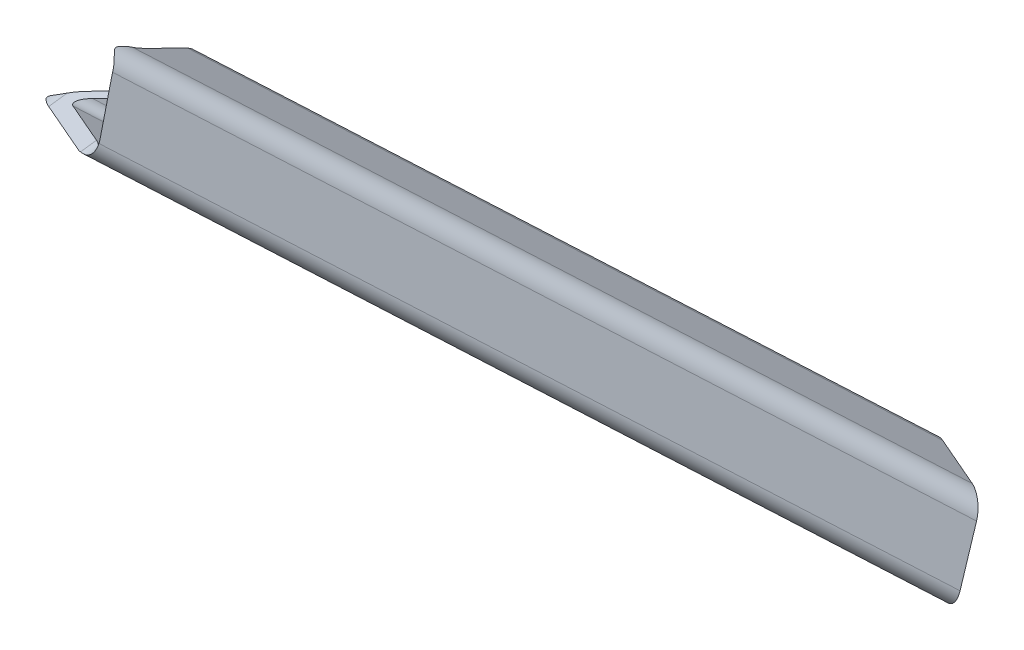
ISO-10303-21;
HEADER;
FILE_DESCRIPTION(('STEP AP214'),'2;1');
FILE_NAME('part.step','',(''),(''),'','','');
FILE_SCHEMA(('AUTOMOTIVE_DESIGN { 1 0 10303 214 1 1 1 1 }'));
ENDSEC;
DATA;
#1=APPLICATION_CONTEXT('core data for automotive mechanical design processes');
#2=APPLICATION_PROTOCOL_DEFINITION('international standard','automotive_design',2000,#1);
#3=PRODUCT_CONTEXT('',#1,'mechanical');
#4=PRODUCT('Part','Part','',(#3));
#5=PRODUCT_RELATED_PRODUCT_CATEGORY('part','',(#4));
#6=PRODUCT_DEFINITION_FORMATION('','',#4);
#7=PRODUCT_DEFINITION_CONTEXT('part definition',#1,'design');
#8=PRODUCT_DEFINITION('design','',#6,#7);
#9=PRODUCT_DEFINITION_SHAPE('','',#8);
#10=(LENGTH_UNIT() NAMED_UNIT(*) SI_UNIT(.MILLI.,.METRE.));
#11=(NAMED_UNIT(*) PLANE_ANGLE_UNIT() SI_UNIT($,.RADIAN.));
#12=(NAMED_UNIT(*) SI_UNIT($,.STERADIAN.) SOLID_ANGLE_UNIT());
#13=UNCERTAINTY_MEASURE_WITH_UNIT(LENGTH_MEASURE(1.E-05),#10,'distance_accuracy_value','');
#14=(GEOMETRIC_REPRESENTATION_CONTEXT(3) GLOBAL_UNCERTAINTY_ASSIGNED_CONTEXT((#13)) GLOBAL_UNIT_ASSIGNED_CONTEXT((#10,
#11,#12)) REPRESENTATION_CONTEXT('',''));
#15=CARTESIAN_POINT('',(0.,0.,0.));
#16=DIRECTION('',(0.,0.,1.));
#17=DIRECTION('',(1.,0.,0.));
#18=AXIS2_PLACEMENT_3D('',#15,#16,#17);
#19=CARTESIAN_POINT('',(-176.376219057879,-6.76934376969705,-997.430262814315));
#20=DIRECTION('',(0.708778209555371,0.212903658810695,0.672536602516548));
#21=DIRECTION('',(0.688317522845566,0.,-0.725409531053835));
#22=AXIS2_PLACEMENT_3D('',#19,#20,#21);
#23=PLANE('',#22);
#24=DIRECTION('',(0.672536602516548,-0.491671667636119,-0.553130626090634));
#25=VECTOR('',#24,1.);
#26=CARTESIAN_POINT('',(-176.376219057879,-6.76934376969705,-997.430262814315));
#27=LINE('',#26,#25);
#28=CARTESIAN_POINT('',(-171.957142857143,-10.,-1001.06475107341));
#29=VERTEX_POINT('',#28);
#30=CARTESIAN_POINT('',(-68.,-85.9999999999999,-1086.56475107341));
#31=VERTEX_POINT('',#30);
#32=EDGE_CURVE('E271',#29,#31,#27,.T.);
#33=ORIENTED_EDGE('',*,*,#32,.T.);
#34=DIRECTION('',(0.,0.953369256848501,-0.301806328787413));
#35=VECTOR('',#34,1.);
#36=CARTESIAN_POINT('',(-68.0000000000001,-39.6331539182495,-1101.24301712075));
#37=LINE('',#36,#35);
#38=CARTESIAN_POINT('',(-68.0000000000001,-73.9999999999998,-1090.36356870827));
#39=VERTEX_POINT('',#38);
#40=EDGE_CURVE('E273',#31,#39,#37,.T.);
#41=ORIENTED_EDGE('',*,*,#40,.T.);
#42=DIRECTION('',(0.672536602516548,-0.491671667636119,-0.553130626090634));
#43=VECTOR('',#42,1.);
#44=CARTESIAN_POINT('',(-173.82137515215,3.36288522872609,-1003.33032282595));
#45=LINE('',#44,#43);
#46=CARTESIAN_POINT('',(-161.475922176263,-5.66251120273223,-1013.48389381134));
#47=VERTEX_POINT('',#46);
#48=EDGE_CURVE('E45',#47,#39,#45,.T.);
#49=ORIENTED_EDGE('',*,*,#48,.F.);
#50=DIRECTION('',(0.0310586126136645,-0.961862937380512,0.271762860369564));
#51=VECTOR('',#50,1.);
#52=CARTESIAN_POINT('',(-161.321727986959,-10.4377945579732,-1012.13469465493));
#53=LINE('',#52,#51);
#54=CARTESIAN_POINT('',(-161.46502464252,-6.00000000000001,-1013.38854039109));
#55=VERTEX_POINT('',#54);
#56=EDGE_CURVE('E278',#47,#55,#53,.T.);
#57=ORIENTED_EDGE('',*,*,#56,.T.);
#58=CARTESIAN_POINT('',(-165.058275621129,-6.00000000000001,-1009.6016565463));
#59=DIRECTION('',(0.708778209555371,0.212903658810695,0.672536602516548));
#60=DIRECTION('',(-0.629148245586715,-0.240432271061151,0.739164939717473));
#61=AXIS2_PLACEMENT_3D('',#58,#59,#60);
#62=ELLIPSE('',#61,5.34283333451752,4.);
#63=CARTESIAN_POINT('',(-164.929115378409,-10.,-1008.47150442251));
#64=VERTEX_POINT('',#63);
#65=EDGE_CURVE('E283',#55,#64,#62,.F.);
#66=ORIENTED_EDGE('',*,*,#65,.T.);
#67=DIRECTION('',(-0.688317522845566,0.,0.725409531053835));
#68=VECTOR('',#67,1.);
#69=CARTESIAN_POINT('',(-175.865561186811,-10.,-996.945716160614));
#70=LINE('',#69,#68);
#71=EDGE_CURVE('E270',#64,#29,#70,.T.);
#72=ORIENTED_EDGE('',*,*,#71,.T.);
#73=EDGE_LOOP('',(#33,#41,#49,#57,#66,#72));
#74=FACE_BOUND('',#73,.T.);
#75=ADVANCED_FACE('F41',(#74),#23,.T.);
#76=CARTESIAN_POINT('',(-174.958662638768,-6.34353645207573,-996.085189609282));
#77=DIRECTION('',(0.672536602516548,-0.491671667636119,-0.553130626090634));
#78=DIRECTION('',(-0.635212340611803,0.,-0.77233754429943));
#79=AXIS2_PLACEMENT_3D('',#76,#77,#78);
#80=CYLINDRICAL_SURFACE('',#79,2.);
#81=DIRECTION('',(0.672536602516548,-0.491671667636119,-0.553130626090634));
#82=VECTOR('',#81,1.);
#83=CARTESIAN_POINT('',(-175.384469956389,-8.03224128514622,-995.10184627401));
#84=LINE('',#83,#82);
#85=CARTESIAN_POINT('',(-172.692857142857,-10.,-997.31557482822));
#86=VERTEX_POINT('',#85);
#87=CARTESIAN_POINT('',(-66.,-87.9999999999999,-1085.06557482822));
#88=VERTEX_POINT('',#87);
#89=EDGE_CURVE('E267',#86,#88,#84,.T.);
#90=ORIENTED_EDGE('',*,*,#89,.T.);
#91=CARTESIAN_POINT('',(-66.0000000000001,-85.9999999999999,-1085.6987111007));
#92=DIRECTION('',(0.38158995692014,-0.278969159106107,-0.881229432693505));
#93=DIRECTION('',(0.7113947110933,-0.520079684350193,0.472688784460434));
#94=AXIS2_PLACEMENT_3D('',#91,#92,#93);
#95=ELLIPSE('',#94,2.26955651479654,2.);
#96=EDGE_CURVE('E269',#88,#31,#95,.T.);
#97=ORIENTED_EDGE('',*,*,#96,.T.);
#98=ORIENTED_EDGE('',*,*,#32,.F.);
#99=CARTESIAN_POINT('',(-169.957142857143,-10.,-1000.1987111007));
#100=DIRECTION('',(0.,1.,0.));
#101=DIRECTION('',(0.77233754429943,0.,-0.635212340611803));
#102=AXIS2_PLACEMENT_3D('',#99,#100,#101);
#103=ELLIPSE('',#102,4.06775523514644,2.);
#104=EDGE_CURVE('E266',#29,#86,#103,.T.);
#105=ORIENTED_EDGE('',*,*,#104,.T.);
#106=EDGE_LOOP('',(#90,#97,#98,#105));
#107=FACE_BOUND('',#106,.T.);
#108=ADVANCED_FACE('F368',(#107),#80,.F.);
#109=CARTESIAN_POINT('',(-175.384469956389,-8.03224128514622,-995.10184627401));
#110=DIRECTION('',(0.212903658810694,0.844352416535263,-0.491671667636119));
#111=DIRECTION('',(0.,0.503208632889708,0.864164956351084));
#112=AXIS2_PLACEMENT_3D('',#109,#110,#111);
#113=PLANE('',#112);
#114=DIRECTION('',(0.672536602516548,-0.491671667636119,-0.553130626090634));
#115=VECTOR('',#114,1.);
#116=CARTESIAN_POINT('',(-166.879131441725,-5.47739737941787,-987.031407043811));
#117=LINE('',#116,#115);
#118=CARTESIAN_POINT('',(-161.245350120166,-9.59608868499616,-991.664934762587));
#119=VERTEX_POINT('',#118);
#120=CARTESIAN_POINT('',(-54.0000000000001,-87.9999999999999,-1079.86933499197));
#121=VERTEX_POINT('',#120);
#122=EDGE_CURVE('E262',#119,#121,#117,.T.);
#123=ORIENTED_EDGE('',*,*,#122,.T.);
#124=DIRECTION('',(-0.917660497954147,0.,-0.397365336302184));
#125=VECTOR('',#124,1.);
#126=CARTESIAN_POINT('',(-125.307792250396,-87.9999999999999,-1110.7470342192));
#127=LINE('',#126,#125);
#128=EDGE_CURVE('E265',#121,#88,#127,.T.);
#129=ORIENTED_EDGE('',*,*,#128,.T.);
#130=ORIENTED_EDGE('',*,*,#89,.F.);
#131=DIRECTION('',(0.917660497954147,0.,0.397365336302183));
#132=VECTOR('',#131,1.);
#133=CARTESIAN_POINT('',(-174.152238110074,-10.,-997.94751595473));
#134=LINE('',#133,#132);
#135=CARTESIAN_POINT('',(-163.183555701295,-10.,-993.197857247754));
#136=VERTEX_POINT('',#135);
#137=EDGE_CURVE('E290',#86,#136,#134,.T.);
#138=ORIENTED_EDGE('',*,*,#137,.T.);
#139=CARTESIAN_POINT('',(-162.357626347843,-6.00000000000001,-985.970975405053));
#140=DIRECTION('',(0.212903658810694,0.844352416535263,-0.491671667636119));
#141=DIRECTION('',(0.239820394157188,0.442656968875484,0.864026033434329));
#142=AXIS2_PLACEMENT_3D('',#139,#140,#141);
#143=ELLIPSE('',#142,8.6147970353693,4.);
#144=EDGE_CURVE('E261',#136,#119,#143,.F.);
#145=ORIENTED_EDGE('',*,*,#144,.T.);
#146=EDGE_LOOP('',(#123,#129,#130,#138,#145));
#147=FACE_BOUND('',#146,.T.);
#148=ADVANCED_FACE('F363',(#147),#113,.T.);
#149=CARTESIAN_POINT('',(-166.453324124103,-3.78869254634738,-988.014750379083));
#150=DIRECTION('',(0.672536602516548,-0.491671667636119,-0.553130626090634));
#151=DIRECTION('',(-0.635212340611803,0.,-0.77233754429943));
#152=AXIS2_PLACEMENT_3D('',#149,#150,#151);
#153=CYLINDRICAL_SURFACE('',#152,2.);
#154=DIRECTION('',(0.672536602516548,-0.491671667636119,-0.553130626090634));
#155=VECTOR('',#154,1.);
#156=CARTESIAN_POINT('',(-165.035767704993,-3.36288522872595,-986.66967717405));
#157=LINE('',#156,#155);
#158=CARTESIAN_POINT('',(-159.277059979029,-7.57290654274652,-991.405951152323));
#159=VERTEX_POINT('',#158);
#160=CARTESIAN_POINT('',(-51.9999999999999,-85.9999999999999,-1079.63643129173));
#161=VERTEX_POINT('',#160);
#162=EDGE_CURVE('E257',#159,#161,#157,.T.);
#163=ORIENTED_EDGE('',*,*,#162,.T.);
#164=CARTESIAN_POINT('',(-54.,-85.9999999999999,-1080.50247126444));
#165=DIRECTION('',(0.38158995692014,-0.278969159106107,-0.881229432693505));
#166=DIRECTION('',(0.7113947110933,-0.520079684350193,0.472688784460434));
#167=AXIS2_PLACEMENT_3D('',#164,#165,#166);
#168=ELLIPSE('',#167,2.26955651479654,2.);
#169=EDGE_CURVE('E260',#161,#121,#168,.T.);
#170=ORIENTED_EDGE('',*,*,#169,.T.);
#171=ORIENTED_EDGE('',*,*,#122,.F.);
#172=CARTESIAN_POINT('',(-161.245350120166,-9.59608868499616,-991.664934762587));
#173=CARTESIAN_POINT('',(-161.211785649101,-9.58199244129275,-991.626172332089));
#174=CARTESIAN_POINT('',(-161.176842190155,-9.56669939756344,-991.589060681059));
#175=CARTESIAN_POINT('',(-161.104739244785,-9.53368399526599,-991.518274307102));
#176=CARTESIAN_POINT('',(-161.067581152035,-9.51596315558062,-991.484597458086));
#177=CARTESIAN_POINT('',(-160.991679716209,-9.4781048068601,-991.420878250348));
#178=CARTESIAN_POINT('',(-160.952942321977,-9.45797589788048,-991.390823684321));
#179=CARTESIAN_POINT('',(-160.874271817586,-9.41524926024835,-991.334257802205));
#180=CARTESIAN_POINT('',(-160.834338546033,-9.39265119726272,-991.307746967033));
#181=CARTESIAN_POINT('',(-160.713623878925,-9.32124897613953,-991.233656447006));
#182=CARTESIAN_POINT('',(-160.631715294953,-9.26873353791489,-991.191344676823));
#183=CARTESIAN_POINT('',(-160.468448517828,-9.15424599812852,-991.120780282041));
#184=CARTESIAN_POINT('',(-160.387090826144,-9.09226624488471,-991.09253911267));
#185=CARTESIAN_POINT('',(-160.223834720701,-8.9563210350527,-991.048870404367));
#186=CARTESIAN_POINT('',(-160.142114321532,-8.88190998625724,-991.034157553852));
#187=CARTESIAN_POINT('',(-159.985352013993,-8.72505342414195,-991.019882477441));
#188=CARTESIAN_POINT('',(-159.910309896425,-8.64260816266377,-991.020319776799));
#189=CARTESIAN_POINT('',(-159.767707497347,-8.47000234341472,-991.036326612519));
#190=CARTESIAN_POINT('',(-159.700329692781,-8.37971927636671,-991.052202681487));
#191=CARTESIAN_POINT('',(-159.576571187995,-8.19568831057253,-991.099317663142));
#192=CARTESIAN_POINT('',(-159.520188524438,-8.1019410339725,-991.130553829553));
#193=CARTESIAN_POINT('',(-159.430265330982,-7.93451077745085,-991.19967121199));
#194=CARTESIAN_POINT('',(-159.394420541497,-7.86085471949146,-991.234672641881));
#195=CARTESIAN_POINT('',(-159.330169855464,-7.71521773630569,-991.313644258173));
#196=CARTESIAN_POINT('',(-159.301757716872,-7.6432354520153,-991.357606863284));
#197=CARTESIAN_POINT('',(-159.277059979028,-7.57290654274661,-991.405951152323));
#198=B_SPLINE_CURVE_WITH_KNOTS('',3,(#172,#173,#174,#175,#176,#177,#178,#179,#180,#181,#182,
#183,#184,#185,#186,#187,#188,#189,#190,#191,#192,#193,#194,#195,#196,#197),.UNSPECIFIED.,.F.,
.F.,(4,2,2,2,2,2,2,2,2,2,2,2,4),(0.,0.159451814959154,0.318804325044844,0.477603829337676,
0.636424862413436,0.953197765635142,1.27022814187687,1.60317901989294,1.93611946453498,
2.27580821190034,2.61543624740165,2.88192237694791,3.14818398398992),.UNSPECIFIED.);
#199=EDGE_CURVE('E256',#119,#159,#198,.T.);
#200=ORIENTED_EDGE('',*,*,#199,.T.);
#201=EDGE_LOOP('',(#163,#170,#171,#200));
#202=FACE_BOUND('',#201,.T.);
#203=ADVANCED_FACE('F357',(#202),#153,.F.);
#204=CARTESIAN_POINT('',(-162.480923799264,6.76934376969719,-992.569737185684));
#205=DIRECTION('',(-0.708778209555371,-0.212903658810695,-0.672536602516548));
#206=DIRECTION('',(-0.688317522845566,0.,0.725409531053835));
#207=AXIS2_PLACEMENT_3D('',#204,#205,#206);
#208=PLANE('',#207);
#209=DIRECTION('',(0.672536602516548,-0.491671667636119,-0.553130626090634));
#210=VECTOR('',#209,1.);
#211=CARTESIAN_POINT('',(-162.480923799264,6.76934376969719,-992.569737185684));
#212=LINE('',#211,#210);
#213=CARTESIAN_POINT('',(-159.377443764703,4.5004810812451,-995.122207710192));
#214=VERTEX_POINT('',#213);
#215=CARTESIAN_POINT('',(-51.9999999999999,-73.9999999999999,-1083.43524892659));
#216=VERTEX_POINT('',#215);
#217=EDGE_CURVE('E252',#214,#216,#212,.T.);
#218=ORIENTED_EDGE('',*,*,#217,.T.);
#219=DIRECTION('',(0.,-0.953369256848501,0.301806328787413));
#220=VECTOR('',#219,1.);
#221=CARTESIAN_POINT('',(-51.9999999999999,-26.7326932670135,-1098.39857212406));
#222=LINE('',#221,#220);
#223=EDGE_CURVE('E255',#216,#161,#222,.T.);
#224=ORIENTED_EDGE('',*,*,#223,.T.);
#225=ORIENTED_EDGE('',*,*,#162,.F.);
#226=CARTESIAN_POINT('',(-162.631633572031,-6.00000000000001,-988.368538616696));
#227=DIRECTION('',(-0.708778209555371,-0.212903658810695,-0.672536602516548));
#228=DIRECTION('',(-0.629148245586715,-0.240432271061151,0.739164939717473));
#229=AXIS2_PLACEMENT_3D('',#226,#227,#228);
#230=ELLIPSE('',#229,5.34283333451752,4.);
#231=CARTESIAN_POINT('',(-159.038382593422,-6.00000000000001,-992.155422461488));
#232=VERTEX_POINT('',#231);
#233=EDGE_CURVE('E294',#159,#232,#230,.F.);
#234=ORIENTED_EDGE('',*,*,#233,.T.);
#235=DIRECTION('',(-0.0310586126136645,0.961862937380512,-0.271762860369564));
#236=VECTOR('',#235,1.);
#237=CARTESIAN_POINT('',(-159.426673467823,6.02508964757599,-995.55296761249));
#238=LINE('',#237,#236);
#239=EDGE_CURVE('E251',#232,#214,#238,.T.);
#240=ORIENTED_EDGE('',*,*,#239,.T.);
#241=EDGE_LOOP('',(#218,#224,#225,#234,#240));
#242=FACE_BOUND('',#241,.T.);
#243=ADVANCED_FACE('F362',(#242),#208,.T.);
#244=CARTESIAN_POINT('',(-163.898480218375,6.34353645207576,-993.914810390717));
#245=DIRECTION('',(0.672536602516548,-0.491671667636119,-0.553130626090634));
#246=DIRECTION('',(-0.635212340611803,0.,-0.77233754429943));
#247=AXIS2_PLACEMENT_3D('',#244,#245,#246);
#248=CYLINDRICAL_SURFACE('',#247,2.);
#249=DIRECTION('',(0.672536602516548,-0.491671667636119,-0.553130626090634));
#250=VECTOR('',#249,1.);
#251=CARTESIAN_POINT('',(-163.472672900754,8.03224128514636,-994.898153725989));
#252=LINE('',#251,#250);
#253=CARTESIAN_POINT('',(-159.705895043777,5.27846112861006,-997.996156402092));
#254=VERTEX_POINT('',#253);
#255=CARTESIAN_POINT('',(-54.,-71.9999999999999,-1084.93442517178));
#256=VERTEX_POINT('',#255);
#257=EDGE_CURVE('E247',#254,#256,#252,.T.);
#258=ORIENTED_EDGE('',*,*,#257,.T.);
#259=CARTESIAN_POINT('',(-54.,-73.9999999999999,-1084.3012888993));
#260=DIRECTION('',(0.38158995692014,-0.278969159106107,-0.881229432693505));
#261=DIRECTION('',(0.7113947110933,-0.520079684350193,0.472688784460434));
#262=AXIS2_PLACEMENT_3D('',#259,#260,#261);
#263=ELLIPSE('',#262,2.26955651479654,2.);
#264=EDGE_CURVE('E250',#256,#216,#263,.T.);
#265=ORIENTED_EDGE('',*,*,#264,.T.);
#266=ORIENTED_EDGE('',*,*,#217,.F.);
#267=CARTESIAN_POINT('',(-159.639753566148,3.23010704574787,-997.417418472836));
#268=DIRECTION('',(-0.993532672656404,0.,0.113546591160732));
#269=DIRECTION('',(-0.0787371194250936,-0.720519705515419,-0.68894979496957));
#270=AXIS2_PLACEMENT_3D('',#267,#268,#269);
#271=ELLIPSE('',#270,2.73600361870277,2.);
#272=EDGE_CURVE('E246',#214,#254,#271,.T.);
#273=ORIENTED_EDGE('',*,*,#272,.T.);
#274=EDGE_LOOP('',(#258,#265,#266,#273));
#275=FACE_BOUND('',#274,.T.);
#276=ADVANCED_FACE('F483',(#275),#248,.F.);
#277=CARTESIAN_POINT('',(-163.472672900754,8.03224128514636,-994.898153725989));
#278=DIRECTION('',(-0.212903658810694,-0.844352416535263,0.491671667636119));
#279=DIRECTION('',(0.,-0.503208632889708,-0.864164956351084));
#280=AXIS2_PLACEMENT_3D('',#277,#278,#279);
#281=PLANE('',#280);
#282=DIRECTION('',(0.672536602516548,-0.491671667636119,-0.553130626090634));
#283=VECTOR('',#282,1.);
#284=CARTESIAN_POINT('',(-171.978011415418,5.47739737941801,-1002.96859295619));
#285=LINE('',#284,#283);
#286=CARTESIAN_POINT('',(-161.279753852447,-2.34378308437295,-1011.76742097795));
#287=VERTEX_POINT('',#286);
#288=CARTESIAN_POINT('',(-66.0000000000001,-71.9999999999999,-1090.13066500803));
#289=VERTEX_POINT('',#288);
#290=EDGE_CURVE('E243',#287,#289,#285,.T.);
#291=ORIENTED_EDGE('',*,*,#290,.T.);
#292=DIRECTION('',(0.917660497954147,0.,0.397365336302184));
#293=VECTOR('',#292,1.);
#294=CARTESIAN_POINT('',(-113.355615509971,-71.9999999999999,-1110.63659298997));
#295=LINE('',#294,#293);
#296=EDGE_CURVE('E223',#289,#256,#295,.T.);
#297=ORIENTED_EDGE('',*,*,#296,.T.);
#298=ORIENTED_EDGE('',*,*,#257,.F.);
#299=DIRECTION('',(-0.099495133200515,-0.481857838250816,-0.870582415504507));
#300=VECTOR('',#299,1.);
#301=CARTESIAN_POINT('',(-159.342815300212,7.03686693921575,-994.819208645901));
#302=LINE('',#301,#300);
#303=EDGE_CURVE('E304',#254,#287,#302,.T.);
#304=ORIENTED_EDGE('',*,*,#303,.T.);
#305=EDGE_LOOP('',(#291,#297,#298,#304));
#306=FACE_BOUND('',#305,.T.);
#307=ADVANCED_FACE('F481',(#306),#281,.T.);
#308=CARTESIAN_POINT('',(-172.403818733039,3.78869254634741,-1001.98524962092));
#309=DIRECTION('',(0.672536602516548,-0.491671667636119,-0.553130626090634));
#310=DIRECTION('',(-0.635212340611803,0.,-0.77233754429943));
#311=AXIS2_PLACEMENT_3D('',#308,#309,#310);
#312=CYLINDRICAL_SURFACE('',#311,2.);
#313=ORIENTED_EDGE('',*,*,#48,.T.);
#314=CARTESIAN_POINT('',(-66.0000000000001,-73.9999999999999,-1089.49752873556));
#315=DIRECTION('',(0.38158995692014,-0.278969159106107,-0.881229432693505));
#316=DIRECTION('',(0.7113947110933,-0.520079684350193,0.472688784460434));
#317=AXIS2_PLACEMENT_3D('',#314,#315,#316);
#318=ELLIPSE('',#317,2.26955651479654,2.);
#319=EDGE_CURVE('E59',#39,#289,#318,.T.);
#320=ORIENTED_EDGE('',*,*,#319,.T.);
#321=ORIENTED_EDGE('',*,*,#290,.F.);
#322=CARTESIAN_POINT('',(-161.213612374818,-4.39213716723515,-1011.1886830487));
#323=DIRECTION('',(-0.993532672656404,0.,0.113546591160732));
#324=DIRECTION('',(-0.0787371194250936,-0.720519705515419,-0.68894979496957));
#325=AXIS2_PLACEMENT_3D('',#322,#323,#324);
#326=ELLIPSE('',#325,2.73600361870277,2.);
#327=EDGE_CURVE('E241',#287,#47,#326,.T.);
#328=ORIENTED_EDGE('',*,*,#327,.T.);
#329=EDGE_LOOP('',(#313,#320,#321,#328));
#330=FACE_BOUND('',#329,.T.);
#331=ADVANCED_FACE('F478',(#330),#312,.F.);
#332=CARTESIAN_POINT('',(-161.063367380154,7.19515108731862,-991.224663980651));
#333=DIRECTION('',(-0.708778209555371,-0.212903658810695,-0.672536602516548));
#334=DIRECTION('',(-0.688317522845566,0.,0.725409531053835));
#335=AXIS2_PLACEMENT_3D('',#332,#333,#334);
#336=PLANE('',#335);
#337=DIRECTION('',(0.,-0.953369256848501,0.301806328787413));
#338=VECTOR('',#337,1.);
#339=CARTESIAN_POINT('',(-50.0000000000001,-26.4835050954647,-1097.61141718639));
#340=LINE('',#339,#338);
#341=CARTESIAN_POINT('',(-50.0000000000001,-73.9999999999998,-1082.56920895388));
#342=VERTEX_POINT('',#341);
#343=CARTESIAN_POINT('',(-50.0000000000001,-85.9999999999999,-1078.77039131902));
#344=VERTEX_POINT('',#343);
#345=EDGE_CURVE('E206',#342,#344,#340,.T.);
#346=ORIENTED_EDGE('',*,*,#345,.F.);
#347=DIRECTION('',(0.672536602516548,-0.491671667636119,-0.553130626090634));
#348=VECTOR('',#347,1.);
#349=CARTESIAN_POINT('',(-161.063367380154,7.19515108731862,-991.224663980651));
#350=LINE('',#349,#348);
#351=CARTESIAN_POINT('',(-159.115133963258,5.77085511674218,-992.826996947549));
#352=VERTEX_POINT('',#351);
#353=EDGE_CURVE('E193',#352,#342,#350,.T.);
#354=ORIENTED_EDGE('',*,*,#353,.F.);
#355=DIRECTION('',(-0.0310586126136645,0.961862937380512,-0.271762860369564));
#356=VECTOR('',#355,1.);
#357=CARTESIAN_POINT('',(-159.146038287324,6.72793984857004,-993.09740978313));
#358=LINE('',#357,#356);
#359=CARTESIAN_POINT('',(-158.735052337285,-6.00000000000001,-989.501282720288));
#360=VERTEX_POINT('',#359);
#361=EDGE_CURVE('E311',#360,#352,#358,.T.);
#362=ORIENTED_EDGE('',*,*,#361,.F.);
#363=CARTESIAN_POINT('',(-162.328303315894,-6.00000000000001,-985.714398875496));
#364=DIRECTION('',(-0.708778209555371,-0.212903658810695,-0.672536602516548));
#365=DIRECTION('',(-0.629148245586715,-0.240432271061151,0.739164939717473));
#366=AXIS2_PLACEMENT_3D('',#363,#364,#365);
#367=ELLIPSE('',#366,5.34283333451752,4.);
#368=CARTESIAN_POINT('',(-158.746953777153,-6.49831055456135,-989.330990692906));
#369=VERTEX_POINT('',#368);
#370=EDGE_CURVE('E387',#369,#360,#367,.F.);
#371=ORIENTED_EDGE('',*,*,#370,.F.);
#372=DIRECTION('',(0.672536602516548,-0.491671667636119,-0.553130626090634));
#373=VECTOR('',#372,1.);
#374=CARTESIAN_POINT('',(-163.618211285882,-2.93707791110452,-985.324603969017));
#375=LINE('',#374,#373);
#376=EDGE_CURVE('E210',#369,#344,#375,.T.);
#377=ORIENTED_EDGE('',*,*,#376,.T.);
#378=EDGE_LOOP('',(#346,#354,#362,#371,#377));
#379=FACE_BOUND('',#378,.T.);
#380=ADVANCED_FACE('F207',(#379),#336,.F.);
#381=CARTESIAN_POINT('',(-166.453324124103,-3.78869254634738,-988.014750379083));
#382=DIRECTION('',(0.672536602516548,-0.491671667636119,-0.553130626090634));
#383=DIRECTION('',(-0.635212340611803,0.,-0.77233754429943));
#384=AXIS2_PLACEMENT_3D('',#381,#382,#383);
#385=CYLINDRICAL_SURFACE('',#384,4.);
#386=CARTESIAN_POINT('',(-54.,-85.9999999999999,-1080.50247126444));
#387=DIRECTION('',(0.38158995692014,-0.278969159106107,-0.881229432693505));
#388=DIRECTION('',(0.7113947110933,-0.520079684350193,0.472688784460434));
#389=AXIS2_PLACEMENT_3D('',#386,#387,#388);
#390=ELLIPSE('',#389,4.53911302959308,4.);
#391=CARTESIAN_POINT('',(-54.0000000000001,-89.9999999999999,-1079.23619871949));
#392=VERTEX_POINT('',#391);
#393=EDGE_CURVE('E213',#344,#392,#390,.T.);
#394=ORIENTED_EDGE('',*,*,#393,.F.);
#395=ORIENTED_EDGE('',*,*,#376,.F.);
#396=CARTESIAN_POINT('',(-162.707415264019,-10.,-989.031628421595));
#397=CARTESIAN_POINT('',(-162.593116270686,-9.99999223676025,-989.013270013667));
#398=CARTESIAN_POINT('',(-162.478893840789,-9.99533944233705,-988.994426026259));
#399=CARTESIAN_POINT('',(-162.251145469622,-9.97675247811838,-988.956832622086));
#400=CARTESIAN_POINT('',(-162.137619817816,-9.96281468386487,-988.938083245131));
#401=CARTESIAN_POINT('',(-161.911346823459,-9.92557562669522,-988.901672023939));
#402=CARTESIAN_POINT('',(-161.798605999108,-9.90222892127252,-988.884015944479));
#403=CARTESIAN_POINT('',(-161.575181855446,-9.84617476193138,-988.850698450474));
#404=CARTESIAN_POINT('',(-161.464498288149,-9.81346844413839,-988.835036794169));
#405=CARTESIAN_POINT('',(-161.245592453536,-9.73860774684832,-988.806351613075));
#406=CARTESIAN_POINT('',(-161.1373796223,-9.69642223164794,-988.793337057731));
#407=CARTESIAN_POINT('',(-160.924681906948,-9.60278090232427,-988.770609565027));
#408=CARTESIAN_POINT('',(-160.820196693423,-9.55132590978426,-988.760896335278));
#409=CARTESIAN_POINT('',(-160.616107725845,-9.43948589239754,-988.745303275916));
#410=CARTESIAN_POINT('',(-160.516493807041,-9.37912062035819,-988.739415118754));
#411=CARTESIAN_POINT('',(-160.322884663397,-9.24973578496207,-988.731873983266));
#412=CARTESIAN_POINT('',(-160.228888776163,-9.180717244854,-988.730220504684));
#413=CARTESIAN_POINT('',(-160.055289846211,-9.04082868189088,-988.731443790101));
#414=CARTESIAN_POINT('',(-159.97514416901,-8.97062801135163,-988.733943286439));
#415=CARTESIAN_POINT('',(-159.821075387778,-8.82394612834274,-988.742974212615));
#416=CARTESIAN_POINT('',(-159.747151672632,-8.7474655341429,-988.749505245952));
#417=CARTESIAN_POINT('',(-159.606170277033,-8.58883205241174,-988.766738136486));
#418=CARTESIAN_POINT('',(-159.539113171585,-8.50667869081033,-988.777440342614));
#419=CARTESIAN_POINT('',(-159.412455450942,-8.33747190192802,-988.803071841643));
#420=CARTESIAN_POINT('',(-159.352854315508,-8.2504188171397,-988.818000839383));
#421=CARTESIAN_POINT('',(-159.195011282325,-7.99760173182809,-988.866372753524));
#422=CARTESIAN_POINT('',(-159.106091713986,-7.82684470522627,-988.904862550471));
#423=CARTESIAN_POINT('',(-158.956747287271,-7.4769007061882,-988.995640438703));
#424=CARTESIAN_POINT('',(-158.896314326136,-7.2977161468553,-989.047924599697));
#425=CARTESIAN_POINT('',(-158.823828689936,-7.01420750953959,-989.140004834503));
#426=CARTESIAN_POINT('',(-158.802146695838,-6.91082794464194,-989.175502093977));
#427=CARTESIAN_POINT('',(-158.767853124805,-6.70427295878863,-989.250371909681));
#428=CARTESIAN_POINT('',(-158.755218239933,-6.60109770114,-989.289734208443));
#429=CARTESIAN_POINT('',(-158.746953777153,-6.49831055456124,-989.330990692906));
#430=B_SPLINE_CURVE_WITH_KNOTS('',3,(#396,#397,#398,#399,#400,#401,#402,#403,#404,#405,#406,
#407,#408,#409,#410,#411,#412,#413,#414,#415,#416,#417,#418,#419,#420,#421,#422,#423,#424,#425,
#426,#427,#428,#429),.UNSPECIFIED.,.F.,.F.,(4,2,2,2,2,2,2,2,2,2,2,2,2,2,2,2,4),(0.,
0.347202649675882,0.694540911568564,1.04357722190945,1.39257118210394,1.74272866602292,
2.0928551296256,2.44221675701893,2.79153711130523,3.11082447752164,3.43008044692527,
3.74936312874215,4.06862352022455,4.65463384013236,5.24047737394901,5.57438382878194,
5.9074269195339),.UNSPECIFIED.);
#431=CARTESIAN_POINT('',(-162.707415264019,-10.,-989.031628421595));
#432=VERTEX_POINT('',#431);
#433=EDGE_CURVE('E342',#432,#369,#430,.T.);
#434=ORIENTED_EDGE('',*,*,#433,.F.);
#435=CARTESIAN_POINT('',(-157.957142857143,-10.,-995.002471264443));
#436=DIRECTION('',(0.,1.,0.));
#437=DIRECTION('',(0.77233754429943,0.,-0.635212340611803));
#438=AXIS2_PLACEMENT_3D('',#435,#436,#437);
#439=ELLIPSE('',#438,8.13551047029288,4.);
#440=CARTESIAN_POINT('',(-163.428571428571,-10.,-989.236198719489));
#441=VERTEX_POINT('',#440);
#442=EDGE_CURVE('E321',#441,#432,#439,.T.);
#443=ORIENTED_EDGE('',*,*,#442,.F.);
#444=DIRECTION('',(0.672536602516548,-0.491671667636119,-0.553130626090634));
#445=VECTOR('',#444,1.);
#446=CARTESIAN_POINT('',(-167.304938759346,-7.16610221248835,-986.048063708539));
#447=LINE('',#446,#445);
#448=EDGE_CURVE('E238',#441,#392,#447,.T.);
#449=ORIENTED_EDGE('',*,*,#448,.T.);
#450=EDGE_LOOP('',(#394,#395,#434,#443,#449));
#451=FACE_BOUND('',#450,.T.);
#452=ADVANCED_FACE('F441',(#451),#385,.T.);
#453=CARTESIAN_POINT('',(-175.810277274011,-9.72094611821671,-994.118502938737));
#454=DIRECTION('',(0.212903658810694,0.844352416535263,-0.491671667636119));
#455=DIRECTION('',(0.,0.503208632889708,0.864164956351084));
#456=AXIS2_PLACEMENT_3D('',#453,#454,#455);
#457=PLANE('',#456);
#458=DIRECTION('',(-0.917660497954147,0.,-0.397365336302184));
#459=VECTOR('',#458,1.);
#460=CARTESIAN_POINT('',(-125.538663158691,-89.9999999999999,-1110.21386966429));
#461=LINE('',#460,#459);
#462=CARTESIAN_POINT('',(-66.,-89.9999999999999,-1084.43243855574));
#463=VERTEX_POINT('',#462);
#464=EDGE_CURVE('E438',#392,#463,#461,.T.);
#465=ORIENTED_EDGE('',*,*,#464,.F.);
#466=ORIENTED_EDGE('',*,*,#448,.F.);
#467=DIRECTION('',(0.917660497954147,0.,0.397365336302183));
#468=VECTOR('',#467,1.);
#469=CARTESIAN_POINT('',(-175.635530707079,-10.,-994.522056059699));
#470=LINE('',#469,#468);
#471=CARTESIAN_POINT('',(-175.401420157021,-10.,-994.420681512507));
#472=VERTEX_POINT('',#471);
#473=EDGE_CURVE('E428',#472,#441,#470,.T.);
#474=ORIENTED_EDGE('',*,*,#473,.F.);
#475=CARTESIAN_POINT('',(-174.575490803569,-6.00000000000001,-987.193799669806));
#476=DIRECTION('',(0.212903658810694,0.844352416535263,-0.491671667636119));
#477=DIRECTION('',(0.239820394157188,0.442656968875484,0.864026033434329));
#478=AXIS2_PLACEMENT_3D('',#475,#476,#477);
#479=ELLIPSE('',#478,8.6147970353693,4.);
#480=CARTESIAN_POINT('',(-175.428684925482,-9.99991702575734,-994.432345209721));
#481=VERTEX_POINT('',#480);
#482=EDGE_CURVE('E386',#481,#472,#479,.F.);
#483=ORIENTED_EDGE('',*,*,#482,.F.);
#484=DIRECTION('',(0.672536602516548,-0.491671667636119,-0.553130626090634));
#485=VECTOR('',#484,1.);
#486=CARTESIAN_POINT('',(-175.810277274011,-9.72094611821671,-994.118502938737));
#487=LINE('',#486,#485);
#488=EDGE_CURVE('E235',#481,#463,#487,.T.);
#489=ORIENTED_EDGE('',*,*,#488,.T.);
#490=EDGE_LOOP('',(#465,#466,#474,#483,#489));
#491=FACE_BOUND('',#490,.T.);
#492=ADVANCED_FACE('F447',(#491),#457,.F.);
#493=CARTESIAN_POINT('',(-174.958662638768,-6.34353645207573,-996.085189609282));
#494=DIRECTION('',(0.672536602516548,-0.491671667636119,-0.553130626090634));
#495=DIRECTION('',(-0.635212340611803,0.,-0.77233754429943));
#496=AXIS2_PLACEMENT_3D('',#493,#494,#495);
#497=CYLINDRICAL_SURFACE('',#496,4.);
#498=CARTESIAN_POINT('',(-66.0000000000001,-85.9999999999999,-1085.6987111007));
#499=DIRECTION('',(0.38158995692014,-0.278969159106107,-0.881229432693505));
#500=DIRECTION('',(0.7113947110933,-0.520079684350193,0.472688784460434));
#501=AXIS2_PLACEMENT_3D('',#498,#499,#500);
#502=ELLIPSE('',#501,4.53911302959308,4.);
#503=CARTESIAN_POINT('',(-70.0000000000001,-85.9999999999999,-1087.43079104611));
#504=VERTEX_POINT('',#503);
#505=EDGE_CURVE('E435',#463,#504,#502,.T.);
#506=ORIENTED_EDGE('',*,*,#505,.F.);
#507=ORIENTED_EDGE('',*,*,#488,.F.);
#508=CARTESIAN_POINT('',(-175.950803592922,-10.,-999.227786576641));
#509=CARTESIAN_POINT('',(-176.003277910341,-9.99999777012254,-999.129232831426));
#510=CARTESIAN_POINT('',(-176.05490196478,-9.99849620816958,-999.030233035793));
#511=CARTESIAN_POINT('',(-176.156404296737,-9.99270363878279,-998.831423682311));
#512=CARTESIAN_POINT('',(-176.20628259137,-9.98841265870716,-998.731614132412));
#513=CARTESIAN_POINT('',(-176.303730217226,-9.97730959392023,-998.532326995228));
#514=CARTESIAN_POINT('',(-176.351318412583,-9.97052470138235,-998.432857094405));
#515=CARTESIAN_POINT('',(-176.44464695164,-9.95462863115907,-998.233247021409));
#516=CARTESIAN_POINT('',(-176.490387395545,-9.94551757981965,-998.133106885927));
#517=CARTESIAN_POINT('',(-176.608282810076,-9.91872712978313,-997.86836784686));
#518=CARTESIAN_POINT('',(-176.678773896935,-9.89928001043616,-997.703203598982));
#519=CARTESIAN_POINT('',(-176.813841169247,-9.8556763585348,-997.369302808122));
#520=CARTESIAN_POINT('',(-176.878358695347,-9.83147918924497,-997.200547516796));
#521=CARTESIAN_POINT('',(-176.967790125929,-9.79335490174202,-996.943968186525));
#522=CARTESIAN_POINT('',(-176.99652225613,-9.78026012940343,-996.857351324289));
#523=CARTESIAN_POINT('',(-177.050251956462,-9.75413486464833,-996.682969580655));
#524=CARTESIAN_POINT('',(-177.075251385457,-9.74110434338258,-996.595205294511));
#525=CARTESIAN_POINT('',(-177.119282218671,-9.71634135709112,-996.41899967736));
#526=CARTESIAN_POINT('',(-177.138373921016,-9.70459662572206,-996.33057531244));
#527=CARTESIAN_POINT('',(-177.166780971217,-9.68446573910158,-996.151896065242));
#528=CARTESIAN_POINT('',(-177.176150692097,-9.67606106849717,-996.061654273025));
#529=CARTESIAN_POINT('',(-177.176432770938,-9.66907665290267,-995.921808817404));
#530=CARTESIAN_POINT('',(-177.173816886442,-9.66776361305484,-995.872453421601));
#531=CARTESIAN_POINT('',(-177.161232582171,-9.66838332860461,-995.774853989683));
#532=CARTESIAN_POINT('',(-177.151302102366,-9.67029940077723,-995.726605538683));
#533=CARTESIAN_POINT('',(-177.123023246693,-9.67779278600003,-995.632491660003));
#534=CARTESIAN_POINT('',(-177.104610617098,-9.68339818785706,-995.586647451599));
#535=CARTESIAN_POINT('',(-177.060222504512,-9.69767922727068,-995.499161785097));
#536=CARTESIAN_POINT('',(-177.034215361049,-9.7063677512427,-995.457538924334));
#537=CARTESIAN_POINT('',(-176.962110554138,-9.73042812665144,-995.358662820452));
#538=CARTESIAN_POINT('',(-176.912539711497,-9.74694570332719,-995.304299612452));
#539=CARTESIAN_POINT('',(-176.806274663875,-9.78078922409065,-995.202687247913));
#540=CARTESIAN_POINT('',(-176.749516904615,-9.79812138540491,-995.155511050871));
#541=CARTESIAN_POINT('',(-176.642425946702,-9.82875340335532,-995.0741579519));
#542=CARTESIAN_POINT('',(-176.592751509459,-9.84222123360425,-995.039163015978));
#543=CARTESIAN_POINT('',(-176.491414948881,-9.8679655136101,-994.97168733756));
#544=CARTESIAN_POINT('',(-176.439752047328,-9.88024149015574,-994.939207594721));
#545=CARTESIAN_POINT('',(-176.282318472553,-9.91482912887518,-994.844482721847));
#546=CARTESIAN_POINT('',(-176.174308734369,-9.93483985170226,-994.785099034199));
#547=CARTESIAN_POINT('',(-175.960902682726,-9.9663440755227,-994.674768807947));
#548=CARTESIAN_POINT('',(-175.855715543226,-9.97826263354244,-994.623533091511));
#549=CARTESIAN_POINT('',(-175.64347212126,-9.9947177920477,-994.525141232562));
#550=CARTESIAN_POINT('',(-175.536426611223,-9.99928796551569,-994.477967473577));
#551=CARTESIAN_POINT('',(-175.428684925482,-9.99991702575736,-994.432345209721));
#552=B_SPLINE_CURVE_WITH_KNOTS('',3,(#508,#509,#510,#511,#512,#513,#514,#515,#516,#517,#518,
#519,#520,#521,#522,#523,#524,#525,#526,#527,#528,#529,#530,#531,#532,#533,#534,#535,#536,#537,
#538,#539,#540,#541,#542,#543,#544,#545,#546,#547,#548,#549,#550,#551),.UNSPECIFIED.,.F.,.F.,(4,
2,2,2,2,2,2,2,2,2,2,2,2,2,2,2,2,2,2,2,2,4),(0.,0.334936247296046,0.66986920963763,
1.0012536354613,1.33262006587453,1.87433530077187,2.42090450776743,2.69743763942165,
2.97383259650817,3.24730559329356,3.51924073055805,3.66707732852758,3.81415246718637,
3.96236052405235,4.11119548213749,4.3361324138086,4.56321921050986,4.74981838938091,
4.93649135482327,5.31061446219163,5.66313651279164,6.0140433519551),.UNSPECIFIED.);
#553=CARTESIAN_POINT('',(-175.950803592922,-10.,-999.227786576641));
#554=VERTEX_POINT('',#553);
#555=EDGE_CURVE('E389',#554,#481,#552,.T.);
#556=ORIENTED_EDGE('',*,*,#555,.F.);
#557=CARTESIAN_POINT('',(-169.957142857143,-10.,-1000.1987111007));
#558=DIRECTION('',(0.,1.,0.));
#559=DIRECTION('',(0.77233754429943,0.,-0.635212340611803));
#560=AXIS2_PLACEMENT_3D('',#557,#558,#559);
#561=ELLIPSE('',#560,8.13551047029288,4.);
#562=CARTESIAN_POINT('',(-173.957142857143,-10.,-1001.93079104611));
#563=VERTEX_POINT('',#562);
#564=EDGE_CURVE('E429',#563,#554,#561,.T.);
#565=ORIENTED_EDGE('',*,*,#564,.F.);
#566=DIRECTION('',(0.672536602516548,-0.491671667636119,-0.553130626090634));
#567=VECTOR('',#566,1.);
#568=CARTESIAN_POINT('',(-177.793775476989,-7.19515108731848,-998.775336019348));
#569=LINE('',#568,#567);
#570=EDGE_CURVE('E232',#563,#504,#569,.T.);
#571=ORIENTED_EDGE('',*,*,#570,.T.);
#572=EDGE_LOOP('',(#506,#507,#556,#565,#571));
#573=FACE_BOUND('',#572,.T.);
#574=ADVANCED_FACE('F452',(#573),#497,.T.);
#575=CARTESIAN_POINT('',(-177.793775476989,-7.19515108731848,-998.775336019348));
#576=DIRECTION('',(0.708778209555371,0.212903658810695,0.672536602516548));
#577=DIRECTION('',(0.688317522845566,0.,-0.725409531053835));
#578=AXIS2_PLACEMENT_3D('',#575,#576,#577);
#579=PLANE('',#578);
#580=DIRECTION('',(0.,0.953369256848501,-0.301806328787413));
#581=VECTOR('',#580,1.);
#582=CARTESIAN_POINT('',(-70.0000000000001,-39.8823420897983,-1102.03017205842));
#583=LINE('',#582,#581);
#584=CARTESIAN_POINT('',(-70.0000000000001,-73.9999999999998,-1091.22960868097));
#585=VERTEX_POINT('',#584);
#586=EDGE_CURVE('E432',#504,#585,#583,.T.);
#587=ORIENTED_EDGE('',*,*,#586,.F.);
#588=ORIENTED_EDGE('',*,*,#570,.F.);
#589=DIRECTION('',(-0.688317522845566,0.,0.725409531053835));
#590=VECTOR('',#589,1.);
#591=CARTESIAN_POINT('',(-177.350423392363,-10.,-998.354653638466));
#592=LINE('',#591,#590);
#593=CARTESIAN_POINT('',(-165.232445634547,-10.,-1011.12564416371));
#594=VERTEX_POINT('',#593);
#595=EDGE_CURVE('E310',#594,#563,#592,.T.);
#596=ORIENTED_EDGE('',*,*,#595,.F.);
#597=CARTESIAN_POINT('',(-165.361605877266,-6.00000000000001,-1012.2557962875));
#598=DIRECTION('',(0.708778209555371,0.212903658810695,0.672536602516548));
#599=DIRECTION('',(-0.629148245586715,-0.240432271061151,0.739164939717473));
#600=AXIS2_PLACEMENT_3D('',#597,#598,#599);
#601=ELLIPSE('',#600,5.34283333451752,4.);
#602=CARTESIAN_POINT('',(-161.826061675581,-6.86867553743408,-1015.70686866059));
#603=VERTEX_POINT('',#602);
#604=EDGE_CURVE('E320',#603,#594,#601,.F.);
#605=ORIENTED_EDGE('',*,*,#604,.F.);
#606=DIRECTION('',(0.672536602516548,-0.491671667636119,-0.553130626090634));
#607=VECTOR('',#606,1.);
#608=CARTESIAN_POINT('',(-175.238931571261,2.93707791110477,-1004.67539603098));
#609=LINE('',#608,#607);
#610=EDGE_CURVE('E229',#603,#585,#609,.T.);
#611=ORIENTED_EDGE('',*,*,#610,.T.);
#612=EDGE_LOOP('',(#587,#588,#596,#605,#611));
#613=FACE_BOUND('',#612,.T.);
#614=ADVANCED_FACE('F456',(#613),#579,.F.);
#615=CARTESIAN_POINT('',(-172.403818733039,3.78869254634741,-1001.98524962092));
#616=DIRECTION('',(0.672536602516548,-0.491671667636119,-0.553130626090634));
#617=DIRECTION('',(-0.635212340611803,0.,-0.77233754429943));
#618=AXIS2_PLACEMENT_3D('',#615,#616,#617);
#619=CYLINDRICAL_SURFACE('',#618,4.);
#620=CARTESIAN_POINT('',(-66.0000000000001,-73.9999999999999,-1089.49752873556));
#621=DIRECTION('',(0.38158995692014,-0.278969159106107,-0.881229432693505));
#622=DIRECTION('',(0.7113947110933,-0.520079684350193,0.472688784460434));
#623=AXIS2_PLACEMENT_3D('',#620,#621,#622);
#624=ELLIPSE('',#623,4.53911302959308,4.);
#625=CARTESIAN_POINT('',(-65.9999999999999,-69.9999999999998,-1090.76380128051));
#626=VERTEX_POINT('',#625);
#627=EDGE_CURVE('E51',#585,#626,#624,.T.);
#628=ORIENTED_EDGE('',*,*,#627,.F.);
#629=ORIENTED_EDGE('',*,*,#610,.F.);
#630=CARTESIAN_POINT('',(-161.754376963152,-6.00000000000001,-1015.92037319662));
#631=CARTESIAN_POINT('',(-161.754151523523,-6.05698367373371,-1015.91849550574));
#632=CARTESIAN_POINT('',(-161.754932058631,-6.11391478442033,-1015.91450987097));
#633=CARTESIAN_POINT('',(-161.758399929987,-6.22728194318743,-1015.90218639948));
#634=CARTESIAN_POINT('',(-161.761088532136,-6.28371763740711,-1015.89384567437));
#635=CARTESIAN_POINT('',(-161.76819944756,-6.39456780659014,-1015.8728782356));
#636=CARTESIAN_POINT('',(-161.772587972414,-6.44900031942406,-1015.86033565916));
#637=CARTESIAN_POINT('',(-161.782937849098,-6.55650120587304,-1015.83094147764));
#638=CARTESIAN_POINT('',(-161.788898142427,-6.60957047126519,-1015.81409277275));
#639=CARTESIAN_POINT('',(-161.800032600484,-6.69699633261406,-1015.78235802055));
#640=CARTESIAN_POINT('',(-161.804831367573,-6.73182228581688,-1015.76861763541));
#641=CARTESIAN_POINT('',(-161.81502175582,-6.80082394906195,-1015.73918594585));
#642=CARTESIAN_POINT('',(-161.820417027773,-6.8349939611475,-1015.72348254101));
#643=CARTESIAN_POINT('',(-161.826061675581,-6.868675537434,-1015.70686866059));
#644=B_SPLINE_CURVE_WITH_KNOTS('',3,(#630,#631,#632,#633,#634,#635,#636,#637,#638,#639,#640,
#641,#642,#643),.UNSPECIFIED.,.F.,.F.,(4,2,2,2,2,2,4),(0.,0.171018047434401,0.342149662403513,
0.510041213025956,0.6778199852139,0.790998268413129,0.904912208362764),.UNSPECIFIED.);
#645=CARTESIAN_POINT('',(-161.754376963152,-6.00000000000001,-1015.92037319662));
#646=VERTEX_POINT('',#645);
#647=EDGE_CURVE('E312',#646,#603,#644,.T.);
#648=ORIENTED_EDGE('',*,*,#647,.F.);
#649=CARTESIAN_POINT('',(-161.213612374818,-4.39213716723515,-1011.1886830487));
#650=DIRECTION('',(-0.993532672656404,0.,0.113546591160732));
#651=DIRECTION('',(-0.0787371194250936,-0.720519705515419,-0.68894979496957));
#652=AXIS2_PLACEMENT_3D('',#649,#650,#651);
#653=ELLIPSE('',#652,5.47200723740554,4.);
#654=CARTESIAN_POINT('',(-161.345895330076,-0.295429001510609,-1012.34615890721));
#655=VERTEX_POINT('',#654);
#656=EDGE_CURVE('E420',#655,#646,#653,.T.);
#657=ORIENTED_EDGE('',*,*,#656,.F.);
#658=DIRECTION('',(0.672536602516548,-0.491671667636119,-0.553130626090634));
#659=VECTOR('',#658,1.);
#660=CARTESIAN_POINT('',(-171.552204097797,7.1661022124886,-1003.95193629146));
#661=LINE('',#660,#659);
#662=EDGE_CURVE('E226',#655,#626,#661,.T.);
#663=ORIENTED_EDGE('',*,*,#662,.T.);
#664=EDGE_LOOP('',(#628,#629,#648,#657,#663));
#665=FACE_BOUND('',#664,.T.);
#666=ADVANCED_FACE('F323',(#665),#619,.T.);
#667=CARTESIAN_POINT('',(-163.046865583132,9.72094611821685,-995.881497061261));
#668=DIRECTION('',(-0.212903658810694,-0.844352416535263,0.491671667636119));
#669=DIRECTION('',(0.,-0.503208632889708,-0.864164956351084));
#670=AXIS2_PLACEMENT_3D('',#667,#668,#669);
#671=PLANE('',#670);
#672=DIRECTION('',(0.917660497954147,0.,0.397365336302184));
#673=VECTOR('',#672,1.);
#674=CARTESIAN_POINT('',(-113.124744601677,-69.9999999999999,-1111.16975754489));
#675=LINE('',#674,#673);
#676=CARTESIAN_POINT('',(-54.0000000000001,-69.9999999999999,-1085.56756144426));
#677=VERTEX_POINT('',#676);
#678=EDGE_CURVE('E11',#626,#677,#675,.T.);
#679=ORIENTED_EDGE('',*,*,#678,.F.);
#680=ORIENTED_EDGE('',*,*,#662,.F.);
#681=DIRECTION('',(-0.099495133200515,-0.481857838250816,-0.870582415504507));
#682=VECTOR('',#681,1.);
#683=CARTESIAN_POINT('',(-159.456375725603,8.85556967205542,-995.812862368065));
#684=LINE('',#683,#682);
#685=CARTESIAN_POINT('',(-160.046000428847,5.99999999999998,-1000.97207852145));
#686=VERTEX_POINT('',#685);
#687=EDGE_CURVE('E409',#686,#655,#684,.T.);
#688=ORIENTED_EDGE('',*,*,#687,.F.);
#689=CARTESIAN_POINT('',(-164.281652053574,6.00000000000001,-1002.80620033019));
#690=DIRECTION('',(-0.212903658810694,-0.844352416535263,0.491671667636119));
#691=DIRECTION('',(0.239820394157188,0.442656968875484,0.864026033434329));
#692=AXIS2_PLACEMENT_3D('',#689,#690,#691);
#693=ELLIPSE('',#692,8.6147970353693,4.);
#694=CARTESIAN_POINT('',(-160.05263366668,7.53195150566689,-998.34411600038));
#695=VERTEX_POINT('',#694);
#696=EDGE_CURVE('E219',#695,#686,#693,.F.);
#697=ORIENTED_EDGE('',*,*,#696,.F.);
#698=DIRECTION('',(0.672536602516548,-0.491671667636119,-0.553130626090634));
#699=VECTOR('',#698,1.);
#700=CARTESIAN_POINT('',(-163.046865583132,9.72094611821685,-995.881497061261));
#701=LINE('',#700,#699);
#702=EDGE_CURVE('E187',#695,#677,#701,.T.);
#703=ORIENTED_EDGE('',*,*,#702,.T.);
#704=EDGE_LOOP('',(#679,#680,#688,#697,#703));
#705=FACE_BOUND('',#704,.T.);
#706=ADVANCED_FACE('F377',(#705),#671,.F.);
#707=CARTESIAN_POINT('',(-163.898480218375,6.34353645207576,-993.914810390717));
#708=DIRECTION('',(0.672536602516548,-0.491671667636119,-0.553130626090634));
#709=DIRECTION('',(-0.635212340611803,0.,-0.77233754429943));
#710=AXIS2_PLACEMENT_3D('',#707,#708,#709);
#711=CYLINDRICAL_SURFACE('',#710,4.);
#712=CARTESIAN_POINT('',(-54.,-73.9999999999999,-1084.3012888993));
#713=DIRECTION('',(0.38158995692014,-0.278969159106107,-0.881229432693505));
#714=DIRECTION('',(0.7113947110933,-0.520079684350193,0.472688784460434));
#715=AXIS2_PLACEMENT_3D('',#712,#713,#714);
#716=ELLIPSE('',#715,4.53911302959308,4.);
#717=EDGE_CURVE('E197',#677,#342,#716,.T.);
#718=ORIENTED_EDGE('',*,*,#717,.F.);
#719=ORIENTED_EDGE('',*,*,#702,.F.);
#720=CARTESIAN_POINT('',(-159.123517313894,6.00000000000001,-992.900351265613));
#721=CARTESIAN_POINT('',(-159.128360346885,6.11830195985672,-992.942843460732));
#722=CARTESIAN_POINT('',(-159.138721930501,6.23566347351584,-992.9871840379));
#723=CARTESIAN_POINT('',(-159.16984763449,6.46758236730453,-993.079201147098));
#724=CARTESIAN_POINT('',(-159.190604731727,6.58214158591422,-993.126875408229));
#725=CARTESIAN_POINT('',(-159.24191400264,6.80777759007515,-993.225293521165));
#726=CARTESIAN_POINT('',(-159.272473376617,6.91885174961382,-993.276039607091));
#727=CARTESIAN_POINT('',(-159.342696023563,7.13671102176203,-993.380359322706));
#728=CARTESIAN_POINT('',(-159.382359878785,7.24349585954596,-993.433933133066));
#729=CARTESIAN_POINT('',(-159.46991863649,7.45176071657694,-993.543667937027));
#730=CARTESIAN_POINT('',(-159.5177876775,7.55325613487114,-993.599820407895));
#731=CARTESIAN_POINT('',(-159.621056590119,7.75065479564704,-993.715067663806));
#732=CARTESIAN_POINT('',(-159.676459537133,7.8465557314493,-993.774163644141));
#733=CARTESIAN_POINT('',(-159.79364411092,8.03168633980034,-993.895788208219));
#734=CARTESIAN_POINT('',(-159.855411719869,8.12092995724417,-993.958309112193));
#735=CARTESIAN_POINT('',(-159.983976462038,8.29172288052922,-994.088368125676));
#736=CARTESIAN_POINT('',(-160.050767580282,8.37328113291151,-994.155900233684));
#737=CARTESIAN_POINT('',(-160.160442724613,8.49687966590478,-994.272370012066));
#738=CARTESIAN_POINT('',(-160.202689693652,8.54209504096326,-994.318528057538));
#739=CARTESIAN_POINT('',(-160.286446623479,8.62726610201865,-994.41619818284));
#740=CARTESIAN_POINT('',(-160.327957232786,8.66722663760953,-994.467705246449));
#741=CARTESIAN_POINT('',(-160.394306897825,8.72755954852404,-994.561171947964));
#742=CARTESIAN_POINT('',(-160.420228351941,8.7501070793159,-994.600908151377));
#743=CARTESIAN_POINT('',(-160.468252852461,8.78986276002947,-994.685019471272));
#744=CARTESIAN_POINT('',(-160.490369156672,8.80708962211872,-994.729377579383));
#745=CARTESIAN_POINT('',(-160.528850409749,8.83480123746509,-994.823392907433));
#746=CARTESIAN_POINT('',(-160.545128984257,8.8451865007896,-994.8731165858));
#747=CARTESIAN_POINT('',(-160.570245825275,8.85831293245221,-994.975359735027));
#748=CARTESIAN_POINT('',(-160.579076077238,8.86104587405077,-995.027882152967));
#749=CARTESIAN_POINT('',(-160.592061115611,8.86014135554276,-995.149634741519));
#750=CARTESIAN_POINT('',(-160.593946058986,8.85428882564957,-995.219040568516));
#751=CARTESIAN_POINT('',(-160.590916797482,8.83583210215249,-995.356962435926));
#752=CARTESIAN_POINT('',(-160.585959385157,8.82318531370288,-995.425470038775));
#753=CARTESIAN_POINT('',(-160.571969894788,8.79326526998078,-995.562885862287));
#754=CARTESIAN_POINT('',(-160.562834109222,8.77587911453274,-995.631757256007));
#755=CARTESIAN_POINT('',(-160.542239746547,8.73807177338708,-995.768328008595));
#756=CARTESIAN_POINT('',(-160.530779437272,8.71764832743849,-995.836026452342));
#757=CARTESIAN_POINT('',(-160.494489059435,8.65298602252416,-996.038036043958));
#758=CARTESIAN_POINT('',(-160.467794461719,8.60543530090592,-996.170938261914));
#759=CARTESIAN_POINT('',(-160.413394906671,8.504273558056,-996.434682739392));
#760=CARTESIAN_POINT('',(-160.38568675777,8.45064203118289,-996.565516225106));
#761=CARTESIAN_POINT('',(-160.331024364871,8.33854299053098,-996.825033388517));
#762=CARTESIAN_POINT('',(-160.304069116868,8.2800823732358,-996.953719827015));
#763=CARTESIAN_POINT('',(-160.255816434952,8.16801526255394,-997.189770626109));
#764=CARTESIAN_POINT('',(-160.234284302568,8.11503434966017,-997.297385180568));
#765=CARTESIAN_POINT('',(-160.19277685653,8.00598445469791,-997.51139758389));
#766=CARTESIAN_POINT('',(-160.17280213496,7.94991431187959,-997.617794957024));
#767=CARTESIAN_POINT('',(-160.134892905805,7.83525167809631,-997.828347235026));
#768=CARTESIAN_POINT('',(-160.116941966775,7.77668577659789,-997.932513639525));
#769=CARTESIAN_POINT('',(-160.083145755093,7.6565682360706,-998.139411204295));
#770=CARTESIAN_POINT('',(-160.067299820087,7.59501754458786,-998.242142806886));
#771=CARTESIAN_POINT('',(-160.05263366668,7.53195150566687,-998.34411600038));
#772=B_SPLINE_CURVE_WITH_KNOTS('',3,(#720,#721,#722,#723,#724,#725,#726,#727,#728,#729,#730,
#731,#732,#733,#734,#735,#736,#737,#738,#739,#740,#741,#742,#743,#744,#745,#746,#747,#748,#749,
#750,#751,#752,#753,#754,#755,#756,#757,#758,#759,#760,#761,#762,#763,#764,#765,#766,#767,#768,
#769,#770,#771),.UNSPECIFIED.,.F.,.F.,(4,2,2,2,2,2,2,2,2,2,2,2,2,2,2,2,2,2,2,2,2,2,2,2,2,4),(0.,
0.377179138019047,0.754103799468754,1.13130596889255,1.5085322680049,1.88459076509784,
2.26080323585767,2.63620414575776,3.01116250814661,3.24256754201827,3.4737574948493,
3.63092435154807,3.78753200590571,3.94636951683746,4.10537772289827,4.31323660116971,
4.52241406874148,4.73709141225132,4.95192931843086,5.38260994564183,5.81478871429455,
6.24636061393512,6.61191006373989,6.97759781474069,7.34006222813638,7.70241231803214),.UNSPECIFIED.);
#773=CARTESIAN_POINT('',(-159.123517313894,6.00000000000001,-992.900351265613));
#774=VERTEX_POINT('',#773);
#775=EDGE_CURVE('E379',#774,#695,#772,.T.);
#776=ORIENTED_EDGE('',*,*,#775,.F.);
#777=CARTESIAN_POINT('',(-159.639753566148,3.23010704574787,-997.417418472836));
#778=DIRECTION('',(-0.993532672656404,0.,0.113546591160732));
#779=DIRECTION('',(-0.0787371194250936,-0.720519705515419,-0.68894979496957));
#780=AXIS2_PLACEMENT_3D('',#777,#778,#779);
#781=ELLIPSE('',#780,5.47200723740554,4.);
#782=EDGE_CURVE('E199',#352,#774,#781,.T.);
#783=ORIENTED_EDGE('',*,*,#782,.F.);
#784=ORIENTED_EDGE('',*,*,#353,.T.);
#785=EDGE_LOOP('',(#718,#719,#776,#783,#784));
#786=FACE_BOUND('',#785,.T.);
#787=ADVANCED_FACE('F195',(#786),#711,.T.);
#788=CARTESIAN_POINT('',(-244.038803964062,-6.00000000000001,-1700.68127954697));
#789=DIRECTION('',(0.113546591160732,0.,0.993532672656404));
#790=DIRECTION('',(0.993532672656404,0.,-0.113546591160732));
#791=AXIS2_PLACEMENT_3D('',#788,#789,#790);
#792=CYLINDRICAL_SURFACE('',#791,4.);
#793=ORIENTED_EDGE('',*,*,#199,.F.);
#794=ORIENTED_EDGE('',*,*,#144,.F.);
#795=DIRECTION('',(0.113546591160732,0.,0.993532672656404));
#796=VECTOR('',#795,1.);
#797=CARTESIAN_POINT('',(-244.038803964062,-10.,-1700.68127954697));
#798=LINE('',#797,#796);
#799=EDGE_CURVE('E202',#136,#432,#798,.T.);
#800=ORIENTED_EDGE('',*,*,#799,.T.);
#801=ORIENTED_EDGE('',*,*,#433,.T.);
#802=ORIENTED_EDGE('',*,*,#370,.T.);
#803=DIRECTION('',(0.113546591160732,0.,0.993532672656404));
#804=VECTOR('',#803,1.);
#805=CARTESIAN_POINT('',(-240.064673273436,-6.00000000000001,-1701.13546591161));
#806=LINE('',#805,#804);
#807=EDGE_CURVE('E413',#232,#360,#806,.T.);
#808=ORIENTED_EDGE('',*,*,#807,.F.);
#809=ORIENTED_EDGE('',*,*,#233,.F.);
#810=EDGE_LOOP('',(#793,#794,#800,#801,#802,#808,#809));
#811=FACE_BOUND('',#810,.T.);
#812=ADVANCED_FACE('F335',(#811),#792,.F.);
#813=CARTESIAN_POINT('',(-240.064673273436,-6.00000000000001,-1701.13546591161));
#814=DIRECTION('',(-0.993532672656404,0.,0.113546591160732));
#815=DIRECTION('',(0.113546591160732,0.,0.993532672656404));
#816=AXIS2_PLACEMENT_3D('',#813,#814,#815);
#817=PLANE('',#816);
#818=ORIENTED_EDGE('',*,*,#687,.T.);
#819=ORIENTED_EDGE('',*,*,#656,.T.);
#820=EDGE_CURVE('E416',#646,#55,#806,.T.);
#821=ORIENTED_EDGE('',*,*,#820,.T.);
#822=ORIENTED_EDGE('',*,*,#56,.F.);
#823=ORIENTED_EDGE('',*,*,#327,.F.);
#824=ORIENTED_EDGE('',*,*,#303,.F.);
#825=ORIENTED_EDGE('',*,*,#272,.F.);
#826=ORIENTED_EDGE('',*,*,#239,.F.);
#827=ORIENTED_EDGE('',*,*,#807,.T.);
#828=ORIENTED_EDGE('',*,*,#361,.T.);
#829=ORIENTED_EDGE('',*,*,#782,.T.);
#830=DIRECTION('',(0.113546591160732,0.,0.993532672656404));
#831=VECTOR('',#830,1.);
#832=CARTESIAN_POINT('',(-240.064673273436,6.00000000000001,-1701.13546591161));
#833=LINE('',#832,#831);
#834=EDGE_CURVE('E216',#686,#774,#833,.T.);
#835=ORIENTED_EDGE('',*,*,#834,.F.);
#836=EDGE_LOOP('',(#818,#819,#821,#822,#823,#824,#825,#826,#827,#828,#829,#835));
#837=FACE_BOUND('',#836,.T.);
#838=ADVANCED_FACE('F336',(#837),#817,.T.);
#839=CARTESIAN_POINT('',(-244.038803964062,-10.,-1700.68127954697));
#840=DIRECTION('',(0.,1.,0.));
#841=DIRECTION('',(0.,0.,1.));
#842=AXIS2_PLACEMENT_3D('',#839,#840,#841);
#843=PLANE('',#842);
#844=ORIENTED_EDGE('',*,*,#595,.T.);
#845=ORIENTED_EDGE('',*,*,#564,.T.);
#846=DIRECTION('',(0.113546591160732,0.,0.993532672656404));
#847=VECTOR('',#846,1.);
#848=CARTESIAN_POINT('',(-255.961196035939,-10.,-1699.31872045304));
#849=LINE('',#848,#847);
#850=EDGE_CURVE('E425',#554,#472,#849,.T.);
#851=ORIENTED_EDGE('',*,*,#850,.T.);
#852=ORIENTED_EDGE('',*,*,#473,.T.);
#853=ORIENTED_EDGE('',*,*,#442,.T.);
#854=ORIENTED_EDGE('',*,*,#799,.F.);
#855=ORIENTED_EDGE('',*,*,#137,.F.);
#856=ORIENTED_EDGE('',*,*,#104,.F.);
#857=ORIENTED_EDGE('',*,*,#71,.F.);
#858=EDGE_CURVE('E424',#594,#64,#798,.T.);
#859=ORIENTED_EDGE('',*,*,#858,.F.);
#860=EDGE_LOOP('',(#844,#845,#851,#852,#853,#854,#855,#856,#857,#859));
#861=FACE_BOUND('',#860,.T.);
#862=ADVANCED_FACE('F333',(#861),#843,.T.);
#863=ORIENTED_EDGE('',*,*,#647,.T.);
#864=ORIENTED_EDGE('',*,*,#604,.T.);
#865=ORIENTED_EDGE('',*,*,#858,.T.);
#866=ORIENTED_EDGE('',*,*,#65,.F.);
#867=ORIENTED_EDGE('',*,*,#820,.F.);
#868=EDGE_LOOP('',(#863,#864,#865,#866,#867));
#869=FACE_BOUND('',#868,.T.);
#870=ADVANCED_FACE('F327',(#869),#792,.F.);
#871=CARTESIAN_POINT('',(-255.961196035939,-6.00000000000001,-1699.31872045304));
#872=DIRECTION('',(0.113546591160732,0.,0.993532672656404));
#873=DIRECTION('',(0.993532672656404,0.,-0.113546591160732));
#874=AXIS2_PLACEMENT_3D('',#871,#872,#873);
#875=CYLINDRICAL_SURFACE('',#874,4.);
#876=ORIENTED_EDGE('',*,*,#555,.T.);
#877=ORIENTED_EDGE('',*,*,#482,.T.);
#878=ORIENTED_EDGE('',*,*,#850,.F.);
#879=EDGE_LOOP('',(#876,#877,#878));
#880=FACE_BOUND('',#879,.T.);
#881=ADVANCED_FACE('F332',(#880),#875,.F.);
#882=CARTESIAN_POINT('',(-244.038803964062,6.00000000000001,-1700.68127954697));
#883=DIRECTION('',(0.113546591160732,0.,0.993532672656404));
#884=DIRECTION('',(0.993532672656404,0.,-0.113546591160732));
#885=AXIS2_PLACEMENT_3D('',#882,#883,#884);
#886=CYLINDRICAL_SURFACE('',#885,4.);
#887=ORIENTED_EDGE('',*,*,#775,.T.);
#888=ORIENTED_EDGE('',*,*,#696,.T.);
#889=ORIENTED_EDGE('',*,*,#834,.T.);
#890=EDGE_LOOP('',(#887,#888,#889));
#891=FACE_BOUND('',#890,.T.);
#892=ADVANCED_FACE('F396',(#891),#886,.F.);
#893=CARTESIAN_POINT('',(-60.,-79.9999999999999,-1085.));
#894=DIRECTION('',(0.38158995692014,-0.278969159106107,-0.881229432693505));
#895=DIRECTION('',(-0.917660497954147,0.,-0.397365336302184));
#896=AXIS2_PLACEMENT_3D('',#893,#894,#895);
#897=PLANE('',#896);
#898=ORIENTED_EDGE('',*,*,#40,.F.);
#899=ORIENTED_EDGE('',*,*,#96,.F.);
#900=ORIENTED_EDGE('',*,*,#128,.F.);
#901=ORIENTED_EDGE('',*,*,#169,.F.);
#902=ORIENTED_EDGE('',*,*,#223,.F.);
#903=ORIENTED_EDGE('',*,*,#264,.F.);
#904=ORIENTED_EDGE('',*,*,#296,.F.);
#905=ORIENTED_EDGE('',*,*,#319,.F.);
#906=EDGE_LOOP('',(#898,#899,#900,#901,#902,#903,#904,#905));
#907=FACE_BOUND('',#906,.T.);
#908=ORIENTED_EDGE('',*,*,#717,.T.);
#909=ORIENTED_EDGE('',*,*,#345,.T.);
#910=ORIENTED_EDGE('',*,*,#393,.T.);
#911=ORIENTED_EDGE('',*,*,#464,.T.);
#912=ORIENTED_EDGE('',*,*,#505,.T.);
#913=ORIENTED_EDGE('',*,*,#586,.T.);
#914=ORIENTED_EDGE('',*,*,#627,.T.);
#915=ORIENTED_EDGE('',*,*,#678,.T.);
#916=EDGE_LOOP('',(#908,#909,#910,#911,#912,#913,#914,#915));
#917=FACE_BOUND('',#916,.T.);
#918=ADVANCED_FACE('F43',(#907,#917),#897,.T.);
#919=CLOSED_SHELL('',(#75,#108,#148,#203,#243,#276,#307,#331,#380,#452,#492,#574,#614,#666,#706,
#787,#812,#838,#862,#870,#881,#892,#918));
#920=MANIFOLD_SOLID_BREP('B2',#919);
#921=ADVANCED_BREP_SHAPE_REPRESENTATION('',(#18,#920),#14);
#922=SHAPE_DEFINITION_REPRESENTATION(#9,#921);
ENDSEC;
END-ISO-10303-21;
